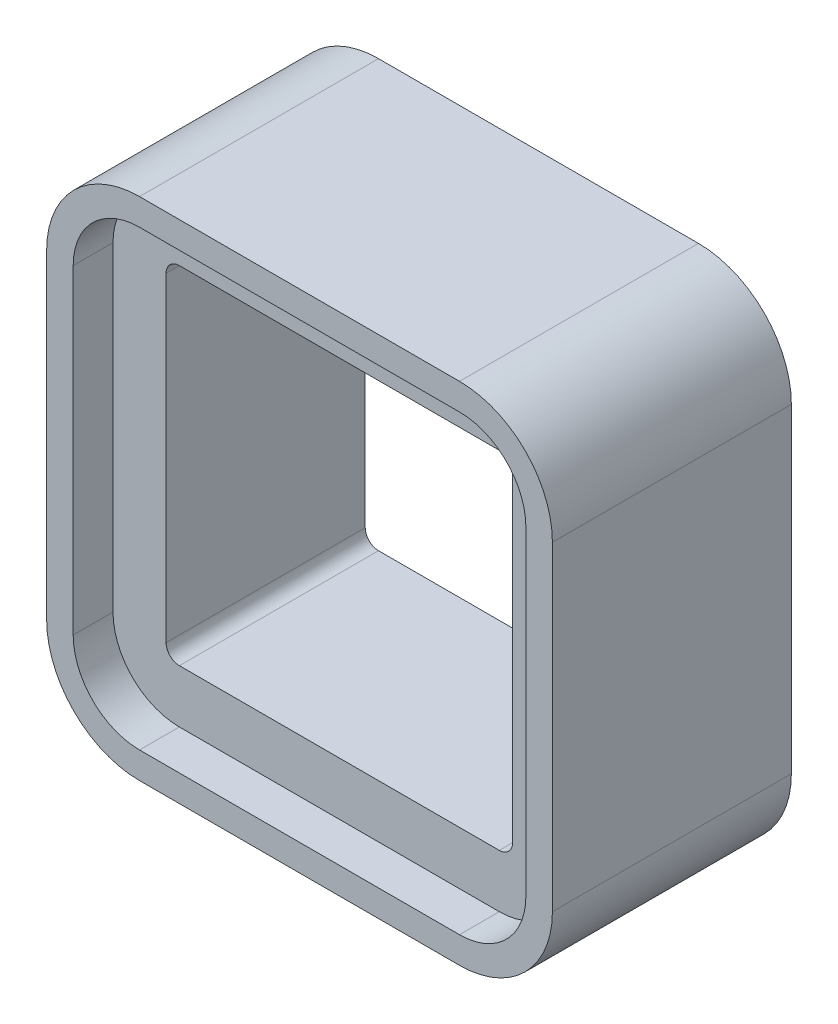
ISO-10303-21;
HEADER;
FILE_DESCRIPTION(('STEP AP214'),'2;1');
FILE_NAME('part.step','',(''),(''),'','','');
FILE_SCHEMA(('AUTOMOTIVE_DESIGN { 1 0 10303 214 1 1 1 1 }'));
ENDSEC;
DATA;
#1=APPLICATION_CONTEXT('core data for automotive mechanical design processes');
#2=APPLICATION_PROTOCOL_DEFINITION('international standard','automotive_design',2000,#1);
#3=PRODUCT_CONTEXT('',#1,'mechanical');
#4=PRODUCT('Part','Part','',(#3));
#5=PRODUCT_RELATED_PRODUCT_CATEGORY('part','',(#4));
#6=PRODUCT_DEFINITION_FORMATION('','',#4);
#7=PRODUCT_DEFINITION_CONTEXT('part definition',#1,'design');
#8=PRODUCT_DEFINITION('design','',#6,#7);
#9=PRODUCT_DEFINITION_SHAPE('','',#8);
#10=(LENGTH_UNIT() NAMED_UNIT(*) SI_UNIT(.MILLI.,.METRE.));
#11=(NAMED_UNIT(*) PLANE_ANGLE_UNIT() SI_UNIT($,.RADIAN.));
#12=(NAMED_UNIT(*) SI_UNIT($,.STERADIAN.) SOLID_ANGLE_UNIT());
#13=UNCERTAINTY_MEASURE_WITH_UNIT(LENGTH_MEASURE(1.E-05),#10,'distance_accuracy_value','');
#14=(GEOMETRIC_REPRESENTATION_CONTEXT(3) GLOBAL_UNCERTAINTY_ASSIGNED_CONTEXT((#13)) GLOBAL_UNIT_ASSIGNED_CONTEXT((#10,
#11,#12)) REPRESENTATION_CONTEXT('',''));
#15=CARTESIAN_POINT('',(0.,0.,0.));
#16=DIRECTION('',(0.,0.,1.));
#17=DIRECTION('',(1.,0.,0.));
#18=AXIS2_PLACEMENT_3D('',#15,#16,#17);
#19=CARTESIAN_POINT('',(0.,0.,0.));
#20=DIRECTION('',(0.,0.,-1.));
#21=DIRECTION('',(-1.,0.,0.));
#22=AXIS2_PLACEMENT_3D('',#19,#20,#21);
#23=PLANE('',#22);
#24=DIRECTION('',(0.,-1.,0.));
#25=VECTOR('',#24,1.);
#26=CARTESIAN_POINT('',(-17.05,-17.05,0.));
#27=LINE('',#26,#25);
#28=CARTESIAN_POINT('',(-17.05,12.05,0.));
#29=VERTEX_POINT('',#28);
#30=CARTESIAN_POINT('',(-17.05,-12.05,0.));
#31=VERTEX_POINT('',#30);
#32=EDGE_CURVE('E281',#29,#31,#27,.T.);
#33=ORIENTED_EDGE('',*,*,#32,.T.);
#34=CARTESIAN_POINT('',(-12.05,-12.05,0.));
#35=DIRECTION('',(0.,0.,-1.));
#36=DIRECTION('',(-1.,0.,0.));
#37=AXIS2_PLACEMENT_3D('',#34,#35,#36);
#38=CIRCLE('',#37,5.);
#39=CARTESIAN_POINT('',(-12.05,-17.05,0.));
#40=VERTEX_POINT('',#39);
#41=EDGE_CURVE('E328',#31,#40,#38,.F.);
#42=ORIENTED_EDGE('',*,*,#41,.T.);
#43=DIRECTION('',(1.,0.,0.));
#44=VECTOR('',#43,1.);
#45=CARTESIAN_POINT('',(17.05,-17.05,0.));
#46=LINE('',#45,#44);
#47=CARTESIAN_POINT('',(12.05,-17.05,0.));
#48=VERTEX_POINT('',#47);
#49=EDGE_CURVE('E298',#40,#48,#46,.T.);
#50=ORIENTED_EDGE('',*,*,#49,.T.);
#51=CARTESIAN_POINT('',(12.05,-12.05,0.));
#52=DIRECTION('',(0.,0.,-1.));
#53=DIRECTION('',(-1.,0.,0.));
#54=AXIS2_PLACEMENT_3D('',#51,#52,#53);
#55=CIRCLE('',#54,5.);
#56=CARTESIAN_POINT('',(17.05,-12.05,0.));
#57=VERTEX_POINT('',#56);
#58=EDGE_CURVE('E322',#48,#57,#55,.F.);
#59=ORIENTED_EDGE('',*,*,#58,.T.);
#60=DIRECTION('',(0.,1.,0.));
#61=VECTOR('',#60,1.);
#62=CARTESIAN_POINT('',(17.05,-17.05,0.));
#63=LINE('',#62,#61);
#64=CARTESIAN_POINT('',(17.05,12.05,0.));
#65=VERTEX_POINT('',#64);
#66=EDGE_CURVE('E301',#57,#65,#63,.T.);
#67=ORIENTED_EDGE('',*,*,#66,.T.);
#68=CARTESIAN_POINT('',(12.05,12.05,0.));
#69=DIRECTION('',(0.,0.,-1.));
#70=DIRECTION('',(-1.,0.,0.));
#71=AXIS2_PLACEMENT_3D('',#68,#69,#70);
#72=CIRCLE('',#71,5.);
#73=CARTESIAN_POINT('',(12.05,17.05,0.));
#74=VERTEX_POINT('',#73);
#75=EDGE_CURVE('E324',#65,#74,#72,.F.);
#76=ORIENTED_EDGE('',*,*,#75,.T.);
#77=DIRECTION('',(-1.,0.,0.));
#78=VECTOR('',#77,1.);
#79=CARTESIAN_POINT('',(17.05,17.05,0.));
#80=LINE('',#79,#78);
#81=CARTESIAN_POINT('',(-12.05,17.05,0.));
#82=VERTEX_POINT('',#81);
#83=EDGE_CURVE('E286',#74,#82,#80,.T.);
#84=ORIENTED_EDGE('',*,*,#83,.T.);
#85=CARTESIAN_POINT('',(-12.05,12.05,0.));
#86=DIRECTION('',(0.,0.,-1.));
#87=DIRECTION('',(-1.,0.,0.));
#88=AXIS2_PLACEMENT_3D('',#85,#86,#87);
#89=CIRCLE('',#88,5.);
#90=EDGE_CURVE('E326',#82,#29,#89,.F.);
#91=ORIENTED_EDGE('',*,*,#90,.T.);
#92=EDGE_LOOP('',(#33,#42,#50,#59,#67,#76,#84,#91));
#93=FACE_BOUND('',#92,.T.);
#94=CARTESIAN_POINT('',(-12.05,12.05,0.));
#95=DIRECTION('',(0.,0.,1.));
#96=DIRECTION('',(1.,0.,0.));
#97=AXIS2_PLACEMENT_3D('',#94,#95,#96);
#98=CIRCLE('',#97,1.);
#99=CARTESIAN_POINT('',(-12.05,13.05,0.));
#100=VERTEX_POINT('',#99);
#101=CARTESIAN_POINT('',(-13.05,12.05,0.));
#102=VERTEX_POINT('',#101);
#103=EDGE_CURVE('E206',#100,#102,#98,.T.);
#104=ORIENTED_EDGE('',*,*,#103,.F.);
#105=DIRECTION('',(-1.,0.,0.));
#106=VECTOR('',#105,1.);
#107=CARTESIAN_POINT('',(12.05,13.05,0.));
#108=LINE('',#107,#106);
#109=CARTESIAN_POINT('',(12.05,13.05,0.));
#110=VERTEX_POINT('',#109);
#111=EDGE_CURVE('E222',#110,#100,#108,.T.);
#112=ORIENTED_EDGE('',*,*,#111,.F.);
#113=CARTESIAN_POINT('',(12.05,12.05,0.));
#114=DIRECTION('',(0.,0.,1.));
#115=DIRECTION('',(1.,0.,0.));
#116=AXIS2_PLACEMENT_3D('',#113,#114,#115);
#117=CIRCLE('',#116,1.);
#118=CARTESIAN_POINT('',(13.05,12.05,0.));
#119=VERTEX_POINT('',#118);
#120=EDGE_CURVE('E54',#119,#110,#117,.T.);
#121=ORIENTED_EDGE('',*,*,#120,.F.);
#122=DIRECTION('',(0.,1.,0.));
#123=VECTOR('',#122,1.);
#124=CARTESIAN_POINT('',(13.05,-12.05,0.));
#125=LINE('',#124,#123);
#126=CARTESIAN_POINT('',(13.05,-12.05,0.));
#127=VERTEX_POINT('',#126);
#128=EDGE_CURVE('E252',#127,#119,#125,.T.);
#129=ORIENTED_EDGE('',*,*,#128,.F.);
#130=CARTESIAN_POINT('',(12.05,-12.05,0.));
#131=DIRECTION('',(0.,0.,1.));
#132=DIRECTION('',(1.,0.,0.));
#133=AXIS2_PLACEMENT_3D('',#130,#131,#132);
#134=CIRCLE('',#133,1.);
#135=CARTESIAN_POINT('',(12.05,-13.05,0.));
#136=VERTEX_POINT('',#135);
#137=EDGE_CURVE('E249',#136,#127,#134,.T.);
#138=ORIENTED_EDGE('',*,*,#137,.F.);
#139=DIRECTION('',(1.,0.,0.));
#140=VECTOR('',#139,1.);
#141=CARTESIAN_POINT('',(-12.05,-13.05,0.));
#142=LINE('',#141,#140);
#143=CARTESIAN_POINT('',(-12.05,-13.05,0.));
#144=VERTEX_POINT('',#143);
#145=EDGE_CURVE('E246',#144,#136,#142,.T.);
#146=ORIENTED_EDGE('',*,*,#145,.F.);
#147=CARTESIAN_POINT('',(-12.05,-12.05,0.));
#148=DIRECTION('',(0.,0.,1.));
#149=DIRECTION('',(1.,0.,0.));
#150=AXIS2_PLACEMENT_3D('',#147,#148,#149);
#151=CIRCLE('',#150,1.);
#152=CARTESIAN_POINT('',(-13.05,-12.05,0.));
#153=VERTEX_POINT('',#152);
#154=EDGE_CURVE('E243',#153,#144,#151,.T.);
#155=ORIENTED_EDGE('',*,*,#154,.F.);
#156=DIRECTION('',(0.,-1.,0.));
#157=VECTOR('',#156,1.);
#158=CARTESIAN_POINT('',(-13.05,12.05,0.));
#159=LINE('',#158,#157);
#160=EDGE_CURVE('E241',#102,#153,#159,.T.);
#161=ORIENTED_EDGE('',*,*,#160,.F.);
#162=EDGE_LOOP('',(#104,#112,#121,#129,#138,#146,#155,#161));
#163=FACE_BOUND('',#162,.T.);
#164=ADVANCED_FACE('F39',(#93,#163),#23,.F.);
#165=CARTESIAN_POINT('',(0.,0.,3.));
#166=DIRECTION('',(0.,0.,1.));
#167=DIRECTION('',(1.,0.,0.));
#168=AXIS2_PLACEMENT_3D('',#165,#166,#167);
#169=PLANE('',#168);
#170=DIRECTION('',(1.,0.,0.));
#171=VECTOR('',#170,1.);
#172=CARTESIAN_POINT('',(19.05,-19.05,3.));
#173=LINE('',#172,#171);
#174=CARTESIAN_POINT('',(-12.05,-19.05,3.));
#175=VERTEX_POINT('',#174);
#176=CARTESIAN_POINT('',(12.05,-19.05,3.));
#177=VERTEX_POINT('',#176);
#178=EDGE_CURVE('E308',#175,#177,#173,.T.);
#179=ORIENTED_EDGE('',*,*,#178,.T.);
#180=CARTESIAN_POINT('',(12.05,-12.05,3.));
#181=DIRECTION('',(0.,0.,1.));
#182=DIRECTION('',(1.,0.,0.));
#183=AXIS2_PLACEMENT_3D('',#180,#181,#182);
#184=CIRCLE('',#183,7.);
#185=CARTESIAN_POINT('',(19.05,-12.05,3.));
#186=VERTEX_POINT('',#185);
#187=EDGE_CURVE('E377',#177,#186,#184,.T.);
#188=ORIENTED_EDGE('',*,*,#187,.T.);
#189=DIRECTION('',(0.,1.,0.));
#190=VECTOR('',#189,1.);
#191=CARTESIAN_POINT('',(19.05,-19.05,3.));
#192=LINE('',#191,#190);
#193=CARTESIAN_POINT('',(19.05,12.05,3.));
#194=VERTEX_POINT('',#193);
#195=EDGE_CURVE('E311',#186,#194,#192,.T.);
#196=ORIENTED_EDGE('',*,*,#195,.T.);
#197=CARTESIAN_POINT('',(12.05,12.05,3.));
#198=DIRECTION('',(0.,0.,1.));
#199=DIRECTION('',(1.,0.,0.));
#200=AXIS2_PLACEMENT_3D('',#197,#198,#199);
#201=CIRCLE('',#200,7.);
#202=CARTESIAN_POINT('',(12.05,19.05,3.));
#203=VERTEX_POINT('',#202);
#204=EDGE_CURVE('E371',#194,#203,#201,.T.);
#205=ORIENTED_EDGE('',*,*,#204,.T.);
#206=DIRECTION('',(-1.,0.,0.));
#207=VECTOR('',#206,1.);
#208=CARTESIAN_POINT('',(19.05,19.05,3.));
#209=LINE('',#208,#207);
#210=CARTESIAN_POINT('',(-12.05,19.05,3.));
#211=VERTEX_POINT('',#210);
#212=EDGE_CURVE('E314',#203,#211,#209,.T.);
#213=ORIENTED_EDGE('',*,*,#212,.T.);
#214=CARTESIAN_POINT('',(-12.05,12.05,3.));
#215=DIRECTION('',(0.,0.,1.));
#216=DIRECTION('',(1.,0.,0.));
#217=AXIS2_PLACEMENT_3D('',#214,#215,#216);
#218=CIRCLE('',#217,7.);
#219=CARTESIAN_POINT('',(-19.05,12.05,3.));
#220=VERTEX_POINT('',#219);
#221=EDGE_CURVE('E373',#211,#220,#218,.T.);
#222=ORIENTED_EDGE('',*,*,#221,.T.);
#223=DIRECTION('',(0.,-1.,0.));
#224=VECTOR('',#223,1.);
#225=CARTESIAN_POINT('',(-19.05,-19.05,3.));
#226=LINE('',#225,#224);
#227=CARTESIAN_POINT('',(-19.05,-12.05,3.));
#228=VERTEX_POINT('',#227);
#229=EDGE_CURVE('E295',#220,#228,#226,.T.);
#230=ORIENTED_EDGE('',*,*,#229,.T.);
#231=CARTESIAN_POINT('',(-12.05,-12.05,3.));
#232=DIRECTION('',(0.,0.,1.));
#233=DIRECTION('',(1.,0.,0.));
#234=AXIS2_PLACEMENT_3D('',#231,#232,#233);
#235=CIRCLE('',#234,7.);
#236=EDGE_CURVE('E375',#228,#175,#235,.T.);
#237=ORIENTED_EDGE('',*,*,#236,.T.);
#238=EDGE_LOOP('',(#179,#188,#196,#205,#213,#222,#230,#237));
#239=FACE_BOUND('',#238,.T.);
#240=DIRECTION('',(1.,0.,0.));
#241=VECTOR('',#240,1.);
#242=CARTESIAN_POINT('',(17.05,-17.05,3.));
#243=LINE('',#242,#241);
#244=CARTESIAN_POINT('',(-12.05,-17.05,3.));
#245=VERTEX_POINT('',#244);
#246=CARTESIAN_POINT('',(12.05,-17.05,3.));
#247=VERTEX_POINT('',#246);
#248=EDGE_CURVE('E285',#245,#247,#243,.T.);
#249=ORIENTED_EDGE('',*,*,#248,.F.);
#250=CARTESIAN_POINT('',(-12.05,-12.05,3.));
#251=DIRECTION('',(0.,0.,1.));
#252=DIRECTION('',(1.,0.,0.));
#253=AXIS2_PLACEMENT_3D('',#250,#251,#252);
#254=CIRCLE('',#253,5.);
#255=CARTESIAN_POINT('',(-17.05,-12.05,3.));
#256=VERTEX_POINT('',#255);
#257=EDGE_CURVE('E345',#245,#256,#254,.F.);
#258=ORIENTED_EDGE('',*,*,#257,.T.);
#259=DIRECTION('',(0.,-1.,0.));
#260=VECTOR('',#259,1.);
#261=CARTESIAN_POINT('',(-17.05,-17.05,3.));
#262=LINE('',#261,#260);
#263=CARTESIAN_POINT('',(-17.05,12.05,3.));
#264=VERTEX_POINT('',#263);
#265=EDGE_CURVE('E282',#264,#256,#262,.T.);
#266=ORIENTED_EDGE('',*,*,#265,.F.);
#267=CARTESIAN_POINT('',(-12.05,12.05,3.));
#268=DIRECTION('',(0.,0.,1.));
#269=DIRECTION('',(1.,0.,0.));
#270=AXIS2_PLACEMENT_3D('',#267,#268,#269);
#271=CIRCLE('',#270,5.);
#272=CARTESIAN_POINT('',(-12.05,17.05,3.));
#273=VERTEX_POINT('',#272);
#274=EDGE_CURVE('E347',#264,#273,#271,.F.);
#275=ORIENTED_EDGE('',*,*,#274,.T.);
#276=DIRECTION('',(-1.,0.,0.));
#277=VECTOR('',#276,1.);
#278=CARTESIAN_POINT('',(17.05,17.05,3.));
#279=LINE('',#278,#277);
#280=CARTESIAN_POINT('',(12.05,17.05,3.));
#281=VERTEX_POINT('',#280);
#282=EDGE_CURVE('E292',#281,#273,#279,.T.);
#283=ORIENTED_EDGE('',*,*,#282,.F.);
#284=CARTESIAN_POINT('',(12.05,12.05,3.));
#285=DIRECTION('',(0.,0.,1.));
#286=DIRECTION('',(1.,0.,0.));
#287=AXIS2_PLACEMENT_3D('',#284,#285,#286);
#288=CIRCLE('',#287,5.);
#289=CARTESIAN_POINT('',(17.05,12.05,3.));
#290=VERTEX_POINT('',#289);
#291=EDGE_CURVE('E349',#281,#290,#288,.F.);
#292=ORIENTED_EDGE('',*,*,#291,.T.);
#293=DIRECTION('',(0.,1.,0.));
#294=VECTOR('',#293,1.);
#295=CARTESIAN_POINT('',(17.05,-17.05,3.));
#296=LINE('',#295,#294);
#297=CARTESIAN_POINT('',(17.05,-12.05,3.));
#298=VERTEX_POINT('',#297);
#299=EDGE_CURVE('E289',#298,#290,#296,.T.);
#300=ORIENTED_EDGE('',*,*,#299,.F.);
#301=CARTESIAN_POINT('',(12.05,-12.05,3.));
#302=DIRECTION('',(0.,0.,1.));
#303=DIRECTION('',(1.,0.,0.));
#304=AXIS2_PLACEMENT_3D('',#301,#302,#303);
#305=CIRCLE('',#304,5.);
#306=EDGE_CURVE('E351',#298,#247,#305,.F.);
#307=ORIENTED_EDGE('',*,*,#306,.T.);
#308=EDGE_LOOP('',(#249,#258,#266,#275,#283,#292,#300,#307));
#309=FACE_BOUND('',#308,.T.);
#310=ADVANCED_FACE('F404',(#239,#309),#169,.T.);
#311=CARTESIAN_POINT('',(-19.05,-19.05,3.));
#312=DIRECTION('',(1.,0.,0.));
#313=DIRECTION('',(0.,0.,-1.));
#314=AXIS2_PLACEMENT_3D('',#311,#312,#313);
#315=PLANE('',#314);
#316=DIRECTION('',(0.,1.,0.));
#317=VECTOR('',#316,1.);
#318=CARTESIAN_POINT('',(-19.05,19.05,-15.));
#319=LINE('',#318,#317);
#320=CARTESIAN_POINT('',(-19.05,-12.05,-15.));
#321=VERTEX_POINT('',#320);
#322=CARTESIAN_POINT('',(-19.05,12.05,-15.));
#323=VERTEX_POINT('',#322);
#324=EDGE_CURVE('E275',#321,#323,#319,.T.);
#325=ORIENTED_EDGE('',*,*,#324,.F.);
#326=DIRECTION('',(0.,0.,-1.));
#327=VECTOR('',#326,1.);
#328=CARTESIAN_POINT('',(-19.05,-12.05,3.));
#329=LINE('',#328,#327);
#330=EDGE_CURVE('E382',#321,#228,#329,.F.);
#331=ORIENTED_EDGE('',*,*,#330,.T.);
#332=ORIENTED_EDGE('',*,*,#229,.F.);
#333=DIRECTION('',(0.,0.,-1.));
#334=VECTOR('',#333,1.);
#335=CARTESIAN_POINT('',(-19.05,12.05,3.));
#336=LINE('',#335,#334);
#337=EDGE_CURVE('E379',#220,#323,#336,.T.);
#338=ORIENTED_EDGE('',*,*,#337,.T.);
#339=EDGE_LOOP('',(#325,#331,#332,#338));
#340=FACE_BOUND('',#339,.T.);
#341=ADVANCED_FACE('F400',(#340),#315,.F.);
#342=CARTESIAN_POINT('',(19.05,-19.05,3.));
#343=DIRECTION('',(0.,1.,0.));
#344=DIRECTION('',(0.,0.,1.));
#345=AXIS2_PLACEMENT_3D('',#342,#343,#344);
#346=PLANE('',#345);
#347=DIRECTION('',(-1.,0.,0.));
#348=VECTOR('',#347,1.);
#349=CARTESIAN_POINT('',(19.05,-19.05,-15.));
#350=LINE('',#349,#348);
#351=CARTESIAN_POINT('',(12.05,-19.05,-15.));
#352=VERTEX_POINT('',#351);
#353=CARTESIAN_POINT('',(-12.05,-19.05,-15.));
#354=VERTEX_POINT('',#353);
#355=EDGE_CURVE('E272',#352,#354,#350,.T.);
#356=ORIENTED_EDGE('',*,*,#355,.F.);
#357=DIRECTION('',(0.,0.,-1.));
#358=VECTOR('',#357,1.);
#359=CARTESIAN_POINT('',(12.05,-19.05,3.));
#360=LINE('',#359,#358);
#361=EDGE_CURVE('E369',#352,#177,#360,.F.);
#362=ORIENTED_EDGE('',*,*,#361,.T.);
#363=ORIENTED_EDGE('',*,*,#178,.F.);
#364=DIRECTION('',(0.,0.,-1.));
#365=VECTOR('',#364,1.);
#366=CARTESIAN_POINT('',(-12.05,-19.05,3.));
#367=LINE('',#366,#365);
#368=EDGE_CURVE('E366',#175,#354,#367,.T.);
#369=ORIENTED_EDGE('',*,*,#368,.T.);
#370=EDGE_LOOP('',(#356,#362,#363,#369));
#371=FACE_BOUND('',#370,.T.);
#372=ADVANCED_FACE('F412',(#371),#346,.F.);
#373=CARTESIAN_POINT('',(19.05,-19.05,3.));
#374=DIRECTION('',(-1.,0.,0.));
#375=DIRECTION('',(0.,0.,1.));
#376=AXIS2_PLACEMENT_3D('',#373,#374,#375);
#377=PLANE('',#376);
#378=ORIENTED_EDGE('',*,*,#195,.F.);
#379=DIRECTION('',(0.,0.,-1.));
#380=VECTOR('',#379,1.);
#381=CARTESIAN_POINT('',(19.05,-12.05,3.));
#382=LINE('',#381,#380);
#383=CARTESIAN_POINT('',(19.05,-12.05,-15.));
#384=VERTEX_POINT('',#383);
#385=EDGE_CURVE('E355',#186,#384,#382,.T.);
#386=ORIENTED_EDGE('',*,*,#385,.T.);
#387=DIRECTION('',(0.,-1.,0.));
#388=VECTOR('',#387,1.);
#389=CARTESIAN_POINT('',(19.05,19.05,-15.));
#390=LINE('',#389,#388);
#391=CARTESIAN_POINT('',(19.05,12.05,-15.));
#392=VERTEX_POINT('',#391);
#393=EDGE_CURVE('E258',#392,#384,#390,.T.);
#394=ORIENTED_EDGE('',*,*,#393,.F.);
#395=DIRECTION('',(0.,0.,-1.));
#396=VECTOR('',#395,1.);
#397=CARTESIAN_POINT('',(19.05,12.05,3.));
#398=LINE('',#397,#396);
#399=EDGE_CURVE('E353',#392,#194,#398,.F.);
#400=ORIENTED_EDGE('',*,*,#399,.T.);
#401=EDGE_LOOP('',(#378,#386,#394,#400));
#402=FACE_BOUND('',#401,.T.);
#403=ADVANCED_FACE('F420',(#402),#377,.F.);
#404=CARTESIAN_POINT('',(19.05,19.05,3.));
#405=DIRECTION('',(0.,-1.,0.));
#406=DIRECTION('',(0.,0.,-1.));
#407=AXIS2_PLACEMENT_3D('',#404,#405,#406);
#408=PLANE('',#407);
#409=DIRECTION('',(1.,0.,0.));
#410=VECTOR('',#409,1.);
#411=CARTESIAN_POINT('',(19.05,19.05,-15.));
#412=LINE('',#411,#410);
#413=CARTESIAN_POINT('',(-12.05,19.05,-15.));
#414=VERTEX_POINT('',#413);
#415=CARTESIAN_POINT('',(12.05,19.05,-15.));
#416=VERTEX_POINT('',#415);
#417=EDGE_CURVE('E278',#414,#416,#412,.T.);
#418=ORIENTED_EDGE('',*,*,#417,.F.);
#419=DIRECTION('',(0.,0.,-1.));
#420=VECTOR('',#419,1.);
#421=CARTESIAN_POINT('',(-12.05,19.05,3.));
#422=LINE('',#421,#420);
#423=EDGE_CURVE('E11',#414,#211,#422,.F.);
#424=ORIENTED_EDGE('',*,*,#423,.T.);
#425=ORIENTED_EDGE('',*,*,#212,.F.);
#426=DIRECTION('',(0.,0.,-1.));
#427=VECTOR('',#426,1.);
#428=CARTESIAN_POINT('',(12.05,19.05,3.));
#429=LINE('',#428,#427);
#430=EDGE_CURVE('E47',#203,#416,#429,.T.);
#431=ORIENTED_EDGE('',*,*,#430,.T.);
#432=EDGE_LOOP('',(#418,#424,#425,#431));
#433=FACE_BOUND('',#432,.T.);
#434=ADVANCED_FACE('F388',(#433),#408,.F.);
#435=CARTESIAN_POINT('',(-17.05,-17.05,3.));
#436=DIRECTION('',(1.,0.,0.));
#437=DIRECTION('',(0.,0.,-1.));
#438=AXIS2_PLACEMENT_3D('',#435,#436,#437);
#439=PLANE('',#438);
#440=ORIENTED_EDGE('',*,*,#265,.T.);
#441=DIRECTION('',(0.,0.,-1.));
#442=VECTOR('',#441,1.);
#443=CARTESIAN_POINT('',(-17.05,-12.05,0.));
#444=LINE('',#443,#442);
#445=EDGE_CURVE('E319',#256,#31,#444,.T.);
#446=ORIENTED_EDGE('',*,*,#445,.T.);
#447=ORIENTED_EDGE('',*,*,#32,.F.);
#448=DIRECTION('',(0.,0.,-1.));
#449=VECTOR('',#448,1.);
#450=CARTESIAN_POINT('',(-17.05,12.05,3.));
#451=LINE('',#450,#449);
#452=EDGE_CURVE('E317',#29,#264,#451,.F.);
#453=ORIENTED_EDGE('',*,*,#452,.T.);
#454=EDGE_LOOP('',(#440,#446,#447,#453));
#455=FACE_BOUND('',#454,.T.);
#456=ADVANCED_FACE('F451',(#455),#439,.T.);
#457=CARTESIAN_POINT('',(17.05,-17.05,3.));
#458=DIRECTION('',(0.,1.,0.));
#459=DIRECTION('',(-1.,0.,0.));
#460=AXIS2_PLACEMENT_3D('',#457,#458,#459);
#461=PLANE('',#460);
#462=ORIENTED_EDGE('',*,*,#49,.F.);
#463=DIRECTION('',(0.,0.,-1.));
#464=VECTOR('',#463,1.);
#465=CARTESIAN_POINT('',(-12.05,-17.05,3.));
#466=LINE('',#465,#464);
#467=EDGE_CURVE('E333',#40,#245,#466,.F.);
#468=ORIENTED_EDGE('',*,*,#467,.T.);
#469=ORIENTED_EDGE('',*,*,#248,.T.);
#470=DIRECTION('',(0.,0.,-1.));
#471=VECTOR('',#470,1.);
#472=CARTESIAN_POINT('',(12.05,-17.05,0.));
#473=LINE('',#472,#471);
#474=EDGE_CURVE('E330',#247,#48,#473,.T.);
#475=ORIENTED_EDGE('',*,*,#474,.T.);
#476=EDGE_LOOP('',(#462,#468,#469,#475));
#477=FACE_BOUND('',#476,.T.);
#478=ADVANCED_FACE('F447',(#477),#461,.T.);
#479=CARTESIAN_POINT('',(17.05,-17.05,3.));
#480=DIRECTION('',(-1.,0.,0.));
#481=DIRECTION('',(0.,0.,1.));
#482=AXIS2_PLACEMENT_3D('',#479,#480,#481);
#483=PLANE('',#482);
#484=ORIENTED_EDGE('',*,*,#299,.T.);
#485=DIRECTION('',(0.,0.,-1.));
#486=VECTOR('',#485,1.);
#487=CARTESIAN_POINT('',(17.05,12.05,0.));
#488=LINE('',#487,#486);
#489=EDGE_CURVE('E342',#290,#65,#488,.T.);
#490=ORIENTED_EDGE('',*,*,#489,.T.);
#491=ORIENTED_EDGE('',*,*,#66,.F.);
#492=DIRECTION('',(0.,0.,-1.));
#493=VECTOR('',#492,1.);
#494=CARTESIAN_POINT('',(17.05,-12.05,3.));
#495=LINE('',#494,#493);
#496=EDGE_CURVE('E340',#57,#298,#495,.F.);
#497=ORIENTED_EDGE('',*,*,#496,.T.);
#498=EDGE_LOOP('',(#484,#490,#491,#497));
#499=FACE_BOUND('',#498,.T.);
#500=ADVANCED_FACE('F443',(#499),#483,.T.);
#501=CARTESIAN_POINT('',(17.05,17.05,3.));
#502=DIRECTION('',(0.,-1.,0.));
#503=DIRECTION('',(0.,0.,-1.));
#504=AXIS2_PLACEMENT_3D('',#501,#502,#503);
#505=PLANE('',#504);
#506=ORIENTED_EDGE('',*,*,#282,.T.);
#507=DIRECTION('',(0.,0.,-1.));
#508=VECTOR('',#507,1.);
#509=CARTESIAN_POINT('',(-12.05,17.05,0.));
#510=LINE('',#509,#508);
#511=EDGE_CURVE('E337',#273,#82,#510,.T.);
#512=ORIENTED_EDGE('',*,*,#511,.T.);
#513=ORIENTED_EDGE('',*,*,#83,.F.);
#514=DIRECTION('',(0.,0.,-1.));
#515=VECTOR('',#514,1.);
#516=CARTESIAN_POINT('',(12.05,17.05,3.));
#517=LINE('',#516,#515);
#518=EDGE_CURVE('E335',#74,#281,#517,.F.);
#519=ORIENTED_EDGE('',*,*,#518,.T.);
#520=EDGE_LOOP('',(#506,#512,#513,#519));
#521=FACE_BOUND('',#520,.T.);
#522=ADVANCED_FACE('F440',(#521),#505,.T.);
#523=CARTESIAN_POINT('',(0.,0.,-15.));
#524=DIRECTION('',(0.,0.,-1.));
#525=DIRECTION('',(-1.,0.,0.));
#526=AXIS2_PLACEMENT_3D('',#523,#524,#525);
#527=PLANE('',#526);
#528=CARTESIAN_POINT('',(-12.05,12.05,-15.));
#529=DIRECTION('',(0.,0.,1.));
#530=DIRECTION('',(1.,0.,0.));
#531=AXIS2_PLACEMENT_3D('',#528,#529,#530);
#532=CIRCLE('',#531,1.);
#533=CARTESIAN_POINT('',(-12.05,13.05,-15.));
#534=VERTEX_POINT('',#533);
#535=CARTESIAN_POINT('',(-13.05,12.05,-15.));
#536=VERTEX_POINT('',#535);
#537=EDGE_CURVE('E203',#534,#536,#532,.T.);
#538=ORIENTED_EDGE('',*,*,#537,.T.);
#539=DIRECTION('',(0.,-1.,0.));
#540=VECTOR('',#539,1.);
#541=CARTESIAN_POINT('',(-13.05,12.05,-15.));
#542=LINE('',#541,#540);
#543=CARTESIAN_POINT('',(-13.05,-12.05,-15.));
#544=VERTEX_POINT('',#543);
#545=EDGE_CURVE('E214',#536,#544,#542,.T.);
#546=ORIENTED_EDGE('',*,*,#545,.T.);
#547=CARTESIAN_POINT('',(-12.05,-12.05,-15.));
#548=DIRECTION('',(0.,0.,1.));
#549=DIRECTION('',(1.,0.,0.));
#550=AXIS2_PLACEMENT_3D('',#547,#548,#549);
#551=CIRCLE('',#550,1.);
#552=CARTESIAN_POINT('',(-12.05,-13.05,-15.));
#553=VERTEX_POINT('',#552);
#554=EDGE_CURVE('E62',#544,#553,#551,.T.);
#555=ORIENTED_EDGE('',*,*,#554,.T.);
#556=DIRECTION('',(1.,0.,0.));
#557=VECTOR('',#556,1.);
#558=CARTESIAN_POINT('',(-12.05,-13.05,-15.));
#559=LINE('',#558,#557);
#560=CARTESIAN_POINT('',(12.05,-13.05,-15.));
#561=VERTEX_POINT('',#560);
#562=EDGE_CURVE('E228',#553,#561,#559,.T.);
#563=ORIENTED_EDGE('',*,*,#562,.T.);
#564=CARTESIAN_POINT('',(12.05,-12.05,-15.));
#565=DIRECTION('',(0.,0.,1.));
#566=DIRECTION('',(1.,0.,0.));
#567=AXIS2_PLACEMENT_3D('',#564,#565,#566);
#568=CIRCLE('',#567,1.);
#569=CARTESIAN_POINT('',(13.05,-12.05,-15.));
#570=VERTEX_POINT('',#569);
#571=EDGE_CURVE('E231',#561,#570,#568,.T.);
#572=ORIENTED_EDGE('',*,*,#571,.T.);
#573=DIRECTION('',(0.,1.,0.));
#574=VECTOR('',#573,1.);
#575=CARTESIAN_POINT('',(13.05,-12.05,-15.));
#576=LINE('',#575,#574);
#577=CARTESIAN_POINT('',(13.05,12.05,-15.));
#578=VERTEX_POINT('',#577);
#579=EDGE_CURVE('E234',#570,#578,#576,.T.);
#580=ORIENTED_EDGE('',*,*,#579,.T.);
#581=CARTESIAN_POINT('',(12.05,12.05,-15.));
#582=DIRECTION('',(0.,0.,1.));
#583=DIRECTION('',(1.,0.,0.));
#584=AXIS2_PLACEMENT_3D('',#581,#582,#583);
#585=CIRCLE('',#584,1.);
#586=CARTESIAN_POINT('',(12.05,13.05,-15.));
#587=VERTEX_POINT('',#586);
#588=EDGE_CURVE('E237',#578,#587,#585,.T.);
#589=ORIENTED_EDGE('',*,*,#588,.T.);
#590=DIRECTION('',(-1.,0.,0.));
#591=VECTOR('',#590,1.);
#592=CARTESIAN_POINT('',(12.05,13.05,-15.));
#593=LINE('',#592,#591);
#594=EDGE_CURVE('E211',#587,#534,#593,.T.);
#595=ORIENTED_EDGE('',*,*,#594,.T.);
#596=EDGE_LOOP('',(#538,#546,#555,#563,#572,#580,#589,#595));
#597=FACE_BOUND('',#596,.T.);
#598=ORIENTED_EDGE('',*,*,#393,.T.);
#599=CARTESIAN_POINT('',(12.05,-12.05,-15.));
#600=DIRECTION('',(0.,0.,-1.));
#601=DIRECTION('',(-1.,0.,0.));
#602=AXIS2_PLACEMENT_3D('',#599,#600,#601);
#603=CIRCLE('',#602,7.);
#604=EDGE_CURVE('E364',#384,#352,#603,.T.);
#605=ORIENTED_EDGE('',*,*,#604,.T.);
#606=ORIENTED_EDGE('',*,*,#355,.T.);
#607=CARTESIAN_POINT('',(-12.05,-12.05,-15.));
#608=DIRECTION('',(0.,0.,-1.));
#609=DIRECTION('',(-1.,0.,0.));
#610=AXIS2_PLACEMENT_3D('',#607,#608,#609);
#611=CIRCLE('',#610,7.);
#612=EDGE_CURVE('E362',#354,#321,#611,.T.);
#613=ORIENTED_EDGE('',*,*,#612,.T.);
#614=ORIENTED_EDGE('',*,*,#324,.T.);
#615=CARTESIAN_POINT('',(-12.05,12.05,-15.));
#616=DIRECTION('',(0.,0.,-1.));
#617=DIRECTION('',(-1.,0.,0.));
#618=AXIS2_PLACEMENT_3D('',#615,#616,#617);
#619=CIRCLE('',#618,7.);
#620=EDGE_CURVE('E360',#323,#414,#619,.T.);
#621=ORIENTED_EDGE('',*,*,#620,.T.);
#622=ORIENTED_EDGE('',*,*,#417,.T.);
#623=CARTESIAN_POINT('',(12.05,12.05,-15.));
#624=DIRECTION('',(0.,0.,-1.));
#625=DIRECTION('',(-1.,0.,0.));
#626=AXIS2_PLACEMENT_3D('',#623,#624,#625);
#627=CIRCLE('',#626,7.);
#628=EDGE_CURVE('E358',#416,#392,#627,.T.);
#629=ORIENTED_EDGE('',*,*,#628,.T.);
#630=EDGE_LOOP('',(#598,#605,#606,#613,#614,#621,#622,#629));
#631=FACE_BOUND('',#630,.T.);
#632=ADVANCED_FACE('F218',(#597,#631),#527,.T.);
#633=CARTESIAN_POINT('',(-12.05,-12.05,3.));
#634=DIRECTION('',(0.,0.,1.));
#635=DIRECTION('',(1.,0.,0.));
#636=AXIS2_PLACEMENT_3D('',#633,#634,#635);
#637=CYLINDRICAL_SURFACE('',#636,5.);
#638=ORIENTED_EDGE('',*,*,#257,.F.);
#639=ORIENTED_EDGE('',*,*,#467,.F.);
#640=ORIENTED_EDGE('',*,*,#41,.F.);
#641=ORIENTED_EDGE('',*,*,#445,.F.);
#642=EDGE_LOOP('',(#638,#639,#640,#641));
#643=FACE_BOUND('',#642,.T.);
#644=ADVANCED_FACE('F464',(#643),#637,.F.);
#645=CARTESIAN_POINT('',(-12.05,12.05,3.));
#646=DIRECTION('',(0.,0.,1.));
#647=DIRECTION('',(1.,0.,0.));
#648=AXIS2_PLACEMENT_3D('',#645,#646,#647);
#649=CYLINDRICAL_SURFACE('',#648,5.);
#650=ORIENTED_EDGE('',*,*,#274,.F.);
#651=ORIENTED_EDGE('',*,*,#452,.F.);
#652=ORIENTED_EDGE('',*,*,#90,.F.);
#653=ORIENTED_EDGE('',*,*,#511,.F.);
#654=EDGE_LOOP('',(#650,#651,#652,#653));
#655=FACE_BOUND('',#654,.T.);
#656=ADVANCED_FACE('F467',(#655),#649,.F.);
#657=CARTESIAN_POINT('',(12.05,12.05,3.));
#658=DIRECTION('',(0.,0.,1.));
#659=DIRECTION('',(1.,0.,0.));
#660=AXIS2_PLACEMENT_3D('',#657,#658,#659);
#661=CYLINDRICAL_SURFACE('',#660,5.);
#662=ORIENTED_EDGE('',*,*,#291,.F.);
#663=ORIENTED_EDGE('',*,*,#518,.F.);
#664=ORIENTED_EDGE('',*,*,#75,.F.);
#665=ORIENTED_EDGE('',*,*,#489,.F.);
#666=EDGE_LOOP('',(#662,#663,#664,#665));
#667=FACE_BOUND('',#666,.T.);
#668=ADVANCED_FACE('F471',(#667),#661,.F.);
#669=CARTESIAN_POINT('',(12.05,-12.05,3.));
#670=DIRECTION('',(0.,0.,1.));
#671=DIRECTION('',(1.,0.,0.));
#672=AXIS2_PLACEMENT_3D('',#669,#670,#671);
#673=CYLINDRICAL_SURFACE('',#672,5.);
#674=ORIENTED_EDGE('',*,*,#306,.F.);
#675=ORIENTED_EDGE('',*,*,#496,.F.);
#676=ORIENTED_EDGE('',*,*,#58,.F.);
#677=ORIENTED_EDGE('',*,*,#474,.F.);
#678=EDGE_LOOP('',(#674,#675,#676,#677));
#679=FACE_BOUND('',#678,.T.);
#680=ADVANCED_FACE('F475',(#679),#673,.F.);
#681=CARTESIAN_POINT('',(12.05,-12.05,3.));
#682=DIRECTION('',(0.,0.,-1.));
#683=DIRECTION('',(-1.,0.,0.));
#684=AXIS2_PLACEMENT_3D('',#681,#682,#683);
#685=CYLINDRICAL_SURFACE('',#684,7.);
#686=ORIENTED_EDGE('',*,*,#187,.F.);
#687=ORIENTED_EDGE('',*,*,#361,.F.);
#688=ORIENTED_EDGE('',*,*,#604,.F.);
#689=ORIENTED_EDGE('',*,*,#385,.F.);
#690=EDGE_LOOP('',(#686,#687,#688,#689));
#691=FACE_BOUND('',#690,.T.);
#692=ADVANCED_FACE('F417',(#691),#685,.T.);
#693=CARTESIAN_POINT('',(-12.05,-12.05,3.));
#694=DIRECTION('',(0.,0.,-1.));
#695=DIRECTION('',(-1.,0.,0.));
#696=AXIS2_PLACEMENT_3D('',#693,#694,#695);
#697=CYLINDRICAL_SURFACE('',#696,7.);
#698=ORIENTED_EDGE('',*,*,#236,.F.);
#699=ORIENTED_EDGE('',*,*,#330,.F.);
#700=ORIENTED_EDGE('',*,*,#612,.F.);
#701=ORIENTED_EDGE('',*,*,#368,.F.);
#702=EDGE_LOOP('',(#698,#699,#700,#701));
#703=FACE_BOUND('',#702,.T.);
#704=ADVANCED_FACE('F409',(#703),#697,.T.);
#705=CARTESIAN_POINT('',(-12.05,12.05,3.));
#706=DIRECTION('',(0.,0.,-1.));
#707=DIRECTION('',(-1.,0.,0.));
#708=AXIS2_PLACEMENT_3D('',#705,#706,#707);
#709=CYLINDRICAL_SURFACE('',#708,7.);
#710=ORIENTED_EDGE('',*,*,#221,.F.);
#711=ORIENTED_EDGE('',*,*,#423,.F.);
#712=ORIENTED_EDGE('',*,*,#620,.F.);
#713=ORIENTED_EDGE('',*,*,#337,.F.);
#714=EDGE_LOOP('',(#710,#711,#712,#713));
#715=FACE_BOUND('',#714,.T.);
#716=ADVANCED_FACE('F397',(#715),#709,.T.);
#717=CARTESIAN_POINT('',(12.05,12.05,3.));
#718=DIRECTION('',(0.,0.,-1.));
#719=DIRECTION('',(-1.,0.,0.));
#720=AXIS2_PLACEMENT_3D('',#717,#718,#719);
#721=CYLINDRICAL_SURFACE('',#720,7.);
#722=ORIENTED_EDGE('',*,*,#204,.F.);
#723=ORIENTED_EDGE('',*,*,#399,.F.);
#724=ORIENTED_EDGE('',*,*,#628,.F.);
#725=ORIENTED_EDGE('',*,*,#430,.F.);
#726=EDGE_LOOP('',(#722,#723,#724,#725));
#727=FACE_BOUND('',#726,.T.);
#728=ADVANCED_FACE('F41',(#727),#721,.T.);
#729=CARTESIAN_POINT('',(-12.05,12.05,-15.));
#730=DIRECTION('',(0.,0.,1.));
#731=DIRECTION('',(1.,0.,0.));
#732=AXIS2_PLACEMENT_3D('',#729,#730,#731);
#733=CYLINDRICAL_SURFACE('',#732,1.);
#734=ORIENTED_EDGE('',*,*,#103,.T.);
#735=DIRECTION('',(0.,0.,1.));
#736=VECTOR('',#735,1.);
#737=CARTESIAN_POINT('',(-13.05,12.05,-15.));
#738=LINE('',#737,#736);
#739=EDGE_CURVE('E199',#536,#102,#738,.T.);
#740=ORIENTED_EDGE('',*,*,#739,.F.);
#741=ORIENTED_EDGE('',*,*,#537,.F.);
#742=DIRECTION('',(0.,0.,1.));
#743=VECTOR('',#742,1.);
#744=CARTESIAN_POINT('',(-12.05,13.05,-15.));
#745=LINE('',#744,#743);
#746=EDGE_CURVE('E256',#534,#100,#745,.T.);
#747=ORIENTED_EDGE('',*,*,#746,.T.);
#748=EDGE_LOOP('',(#734,#740,#741,#747));
#749=FACE_BOUND('',#748,.T.);
#750=ADVANCED_FACE('F201',(#749),#733,.F.);
#751=CARTESIAN_POINT('',(12.05,13.05,-15.));
#752=DIRECTION('',(0.,1.,0.));
#753=DIRECTION('',(0.,0.,1.));
#754=AXIS2_PLACEMENT_3D('',#751,#752,#753);
#755=PLANE('',#754);
#756=ORIENTED_EDGE('',*,*,#111,.T.);
#757=ORIENTED_EDGE('',*,*,#746,.F.);
#758=ORIENTED_EDGE('',*,*,#594,.F.);
#759=DIRECTION('',(0.,0.,1.));
#760=VECTOR('',#759,1.);
#761=CARTESIAN_POINT('',(12.05,13.05,-15.));
#762=LINE('',#761,#760);
#763=EDGE_CURVE('E259',#587,#110,#762,.T.);
#764=ORIENTED_EDGE('',*,*,#763,.T.);
#765=EDGE_LOOP('',(#756,#757,#758,#764));
#766=FACE_BOUND('',#765,.T.);
#767=ADVANCED_FACE('F428',(#766),#755,.F.);
#768=CARTESIAN_POINT('',(12.05,12.05,-15.));
#769=DIRECTION('',(0.,0.,1.));
#770=DIRECTION('',(1.,0.,0.));
#771=AXIS2_PLACEMENT_3D('',#768,#769,#770);
#772=CYLINDRICAL_SURFACE('',#771,1.);
#773=ORIENTED_EDGE('',*,*,#120,.T.);
#774=ORIENTED_EDGE('',*,*,#763,.F.);
#775=ORIENTED_EDGE('',*,*,#588,.F.);
#776=DIRECTION('',(0.,0.,1.));
#777=VECTOR('',#776,1.);
#778=CARTESIAN_POINT('',(13.05,12.05,-15.));
#779=LINE('',#778,#777);
#780=EDGE_CURVE('E261',#578,#119,#779,.T.);
#781=ORIENTED_EDGE('',*,*,#780,.T.);
#782=EDGE_LOOP('',(#773,#774,#775,#781));
#783=FACE_BOUND('',#782,.T.);
#784=ADVANCED_FACE('F516',(#783),#772,.F.);
#785=CARTESIAN_POINT('',(13.05,-12.05,-15.));
#786=DIRECTION('',(1.,0.,0.));
#787=DIRECTION('',(0.,0.,-1.));
#788=AXIS2_PLACEMENT_3D('',#785,#786,#787);
#789=PLANE('',#788);
#790=ORIENTED_EDGE('',*,*,#128,.T.);
#791=ORIENTED_EDGE('',*,*,#780,.F.);
#792=ORIENTED_EDGE('',*,*,#579,.F.);
#793=DIRECTION('',(0.,0.,1.));
#794=VECTOR('',#793,1.);
#795=CARTESIAN_POINT('',(13.05,-12.05,-15.));
#796=LINE('',#795,#794);
#797=EDGE_CURVE('E263',#570,#127,#796,.T.);
#798=ORIENTED_EDGE('',*,*,#797,.T.);
#799=EDGE_LOOP('',(#790,#791,#792,#798));
#800=FACE_BOUND('',#799,.T.);
#801=ADVANCED_FACE('F526',(#800),#789,.F.);
#802=CARTESIAN_POINT('',(12.05,-12.05,-15.));
#803=DIRECTION('',(0.,0.,1.));
#804=DIRECTION('',(1.,0.,0.));
#805=AXIS2_PLACEMENT_3D('',#802,#803,#804);
#806=CYLINDRICAL_SURFACE('',#805,1.);
#807=ORIENTED_EDGE('',*,*,#137,.T.);
#808=ORIENTED_EDGE('',*,*,#797,.F.);
#809=ORIENTED_EDGE('',*,*,#571,.F.);
#810=DIRECTION('',(0.,0.,1.));
#811=VECTOR('',#810,1.);
#812=CARTESIAN_POINT('',(12.05,-13.05,-15.));
#813=LINE('',#812,#811);
#814=EDGE_CURVE('E265',#561,#136,#813,.T.);
#815=ORIENTED_EDGE('',*,*,#814,.T.);
#816=EDGE_LOOP('',(#807,#808,#809,#815));
#817=FACE_BOUND('',#816,.T.);
#818=ADVANCED_FACE('F535',(#817),#806,.F.);
#819=CARTESIAN_POINT('',(-12.05,-13.05,-15.));
#820=DIRECTION('',(0.,-1.,0.));
#821=DIRECTION('',(1.,0.,0.));
#822=AXIS2_PLACEMENT_3D('',#819,#820,#821);
#823=PLANE('',#822);
#824=ORIENTED_EDGE('',*,*,#145,.T.);
#825=ORIENTED_EDGE('',*,*,#814,.F.);
#826=ORIENTED_EDGE('',*,*,#562,.F.);
#827=DIRECTION('',(0.,0.,1.));
#828=VECTOR('',#827,1.);
#829=CARTESIAN_POINT('',(-12.05,-13.05,-15.));
#830=LINE('',#829,#828);
#831=EDGE_CURVE('E267',#553,#144,#830,.T.);
#832=ORIENTED_EDGE('',*,*,#831,.T.);
#833=EDGE_LOOP('',(#824,#825,#826,#832));
#834=FACE_BOUND('',#833,.T.);
#835=ADVANCED_FACE('F545',(#834),#823,.F.);
#836=CARTESIAN_POINT('',(-12.05,-12.05,-15.));
#837=DIRECTION('',(0.,0.,1.));
#838=DIRECTION('',(1.,0.,0.));
#839=AXIS2_PLACEMENT_3D('',#836,#837,#838);
#840=CYLINDRICAL_SURFACE('',#839,1.);
#841=ORIENTED_EDGE('',*,*,#154,.T.);
#842=ORIENTED_EDGE('',*,*,#831,.F.);
#843=ORIENTED_EDGE('',*,*,#554,.F.);
#844=DIRECTION('',(0.,0.,1.));
#845=VECTOR('',#844,1.);
#846=CARTESIAN_POINT('',(-13.05,-12.05,-15.));
#847=LINE('',#846,#845);
#848=EDGE_CURVE('E210',#544,#153,#847,.T.);
#849=ORIENTED_EDGE('',*,*,#848,.T.);
#850=EDGE_LOOP('',(#841,#842,#843,#849));
#851=FACE_BOUND('',#850,.T.);
#852=ADVANCED_FACE('F555',(#851),#840,.F.);
#853=CARTESIAN_POINT('',(-13.05,12.05,-15.));
#854=DIRECTION('',(-1.,0.,0.));
#855=DIRECTION('',(0.,0.,1.));
#856=AXIS2_PLACEMENT_3D('',#853,#854,#855);
#857=PLANE('',#856);
#858=ORIENTED_EDGE('',*,*,#160,.T.);
#859=ORIENTED_EDGE('',*,*,#848,.F.);
#860=ORIENTED_EDGE('',*,*,#545,.F.);
#861=ORIENTED_EDGE('',*,*,#739,.T.);
#862=EDGE_LOOP('',(#858,#859,#860,#861));
#863=FACE_BOUND('',#862,.T.);
#864=ADVANCED_FACE('F215',(#863),#857,.F.);
#865=CLOSED_SHELL('',(#164,#310,#341,#372,#403,#434,#456,#478,#500,#522,#632,#644,#656,#668,
#680,#692,#704,#716,#728,#750,#767,#784,#801,#818,#835,#852,#864));
#866=MANIFOLD_SOLID_BREP('B2',#865);
#867=ADVANCED_BREP_SHAPE_REPRESENTATION('',(#18,#866),#14);
#868=SHAPE_DEFINITION_REPRESENTATION(#9,#867);
ENDSEC;
END-ISO-10303-21;
